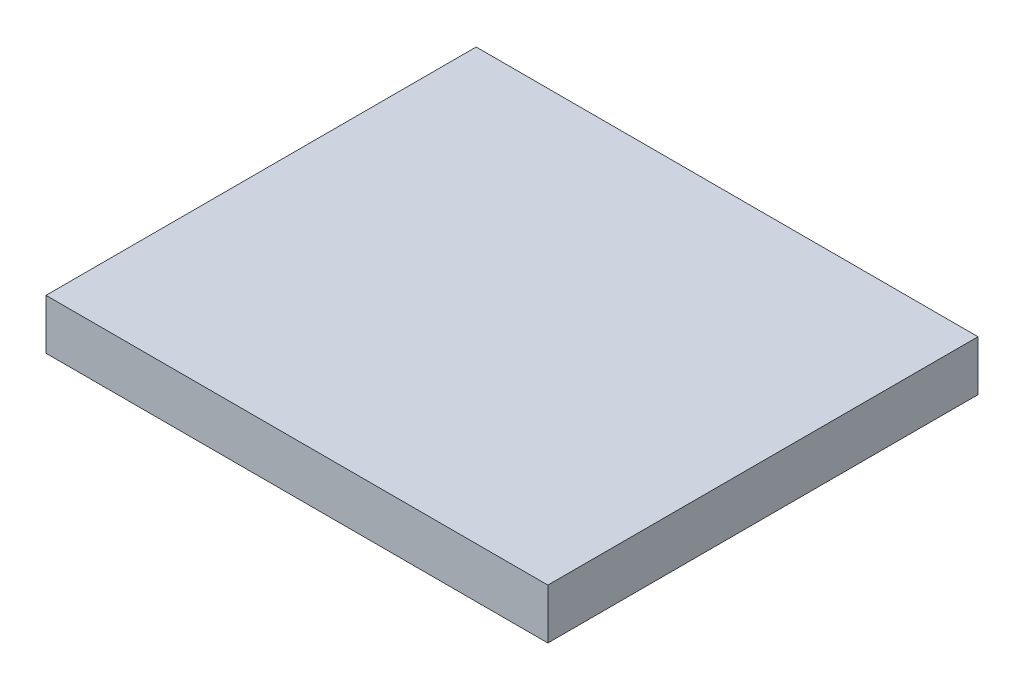
ISO-10303-21;
HEADER;
FILE_DESCRIPTION(('STEP AP214'),'2;1');
FILE_NAME('part.step','',(''),(''),'','','');
FILE_SCHEMA(('AUTOMOTIVE_DESIGN { 1 0 10303 214 1 1 1 1 }'));
ENDSEC;
DATA;
#1=APPLICATION_CONTEXT('core data for automotive mechanical design processes');
#2=APPLICATION_PROTOCOL_DEFINITION('international standard','automotive_design',2000,#1);
#3=PRODUCT_CONTEXT('',#1,'mechanical');
#4=PRODUCT('Part','Part','',(#3));
#5=PRODUCT_RELATED_PRODUCT_CATEGORY('part','',(#4));
#6=PRODUCT_DEFINITION_FORMATION('','',#4);
#7=PRODUCT_DEFINITION_CONTEXT('part definition',#1,'design');
#8=PRODUCT_DEFINITION('design','',#6,#7);
#9=PRODUCT_DEFINITION_SHAPE('','',#8);
#10=(LENGTH_UNIT() NAMED_UNIT(*) SI_UNIT(.MILLI.,.METRE.));
#11=(NAMED_UNIT(*) PLANE_ANGLE_UNIT() SI_UNIT($,.RADIAN.));
#12=(NAMED_UNIT(*) SI_UNIT($,.STERADIAN.) SOLID_ANGLE_UNIT());
#13=UNCERTAINTY_MEASURE_WITH_UNIT(LENGTH_MEASURE(1.E-05),#10,'distance_accuracy_value','');
#14=(GEOMETRIC_REPRESENTATION_CONTEXT(3) GLOBAL_UNCERTAINTY_ASSIGNED_CONTEXT((#13)) GLOBAL_UNIT_ASSIGNED_CONTEXT((#10,
#11,#12)) REPRESENTATION_CONTEXT('',''));
#15=CARTESIAN_POINT('',(0.,0.,0.));
#16=DIRECTION('',(0.,0.,1.));
#17=DIRECTION('',(1.,0.,0.));
#18=AXIS2_PLACEMENT_3D('',#15,#16,#17);
#19=CARTESIAN_POINT('',(17.5,3.5,15.));
#20=DIRECTION('',(-1.,0.,0.));
#21=DIRECTION('',(0.,0.,1.));
#22=AXIS2_PLACEMENT_3D('',#19,#20,#21);
#23=PLANE('',#22);
#24=DIRECTION('',(0.,0.,-1.));
#25=VECTOR('',#24,1.);
#26=CARTESIAN_POINT('',(17.5,0.,15.));
#27=LINE('',#26,#25);
#28=CARTESIAN_POINT('',(17.5,0.,15.));
#29=VERTEX_POINT('',#28);
#30=CARTESIAN_POINT('',(17.5,0.,-15.));
#31=VERTEX_POINT('',#30);
#32=EDGE_CURVE('E102',#29,#31,#27,.T.);
#33=ORIENTED_EDGE('',*,*,#32,.T.);
#34=DIRECTION('',(0.,-1.,0.));
#35=VECTOR('',#34,1.);
#36=CARTESIAN_POINT('',(17.5,3.5,-15.));
#37=LINE('',#36,#35);
#38=CARTESIAN_POINT('',(17.5,3.5,-15.));
#39=VERTEX_POINT('',#38);
#40=EDGE_CURVE('E11',#39,#31,#37,.T.);
#41=ORIENTED_EDGE('',*,*,#40,.F.);
#42=DIRECTION('',(0.,0.,-1.));
#43=VECTOR('',#42,1.);
#44=CARTESIAN_POINT('',(17.5,3.5,15.));
#45=LINE('',#44,#43);
#46=CARTESIAN_POINT('',(17.5,3.5,15.));
#47=VERTEX_POINT('',#46);
#48=EDGE_CURVE('E90',#47,#39,#45,.T.);
#49=ORIENTED_EDGE('',*,*,#48,.F.);
#50=DIRECTION('',(0.,-1.,0.));
#51=VECTOR('',#50,1.);
#52=CARTESIAN_POINT('',(17.5,3.5,15.));
#53=LINE('',#52,#51);
#54=EDGE_CURVE('E98',#47,#29,#53,.T.);
#55=ORIENTED_EDGE('',*,*,#54,.T.);
#56=EDGE_LOOP('',(#33,#41,#49,#55));
#57=FACE_BOUND('',#56,.T.);
#58=ADVANCED_FACE('F39',(#57),#23,.F.);
#59=CARTESIAN_POINT('',(-17.5,3.5,-15.));
#60=DIRECTION('',(0.,0.,1.));
#61=DIRECTION('',(1.,0.,0.));
#62=AXIS2_PLACEMENT_3D('',#59,#60,#61);
#63=PLANE('',#62);
#64=DIRECTION('',(-1.,0.,0.));
#65=VECTOR('',#64,1.);
#66=CARTESIAN_POINT('',(-17.5,0.,-15.));
#67=LINE('',#66,#65);
#68=CARTESIAN_POINT('',(-17.5,0.,-15.));
#69=VERTEX_POINT('',#68);
#70=EDGE_CURVE('E94',#31,#69,#67,.T.);
#71=ORIENTED_EDGE('',*,*,#70,.T.);
#72=DIRECTION('',(0.,-1.,0.));
#73=VECTOR('',#72,1.);
#74=CARTESIAN_POINT('',(-17.5,3.5,-15.));
#75=LINE('',#74,#73);
#76=CARTESIAN_POINT('',(-17.5,3.5,-15.));
#77=VERTEX_POINT('',#76);
#78=EDGE_CURVE('E47',#77,#69,#75,.T.);
#79=ORIENTED_EDGE('',*,*,#78,.F.);
#80=DIRECTION('',(-1.,0.,0.));
#81=VECTOR('',#80,1.);
#82=CARTESIAN_POINT('',(-17.5,3.5,-15.));
#83=LINE('',#82,#81);
#84=EDGE_CURVE('E85',#39,#77,#83,.T.);
#85=ORIENTED_EDGE('',*,*,#84,.F.);
#86=ORIENTED_EDGE('',*,*,#40,.T.);
#87=EDGE_LOOP('',(#71,#79,#85,#86));
#88=FACE_BOUND('',#87,.T.);
#89=ADVANCED_FACE('F93',(#88),#63,.F.);
#90=CARTESIAN_POINT('',(-17.5,3.5,15.));
#91=DIRECTION('',(1.,0.,0.));
#92=DIRECTION('',(0.,0.,-1.));
#93=AXIS2_PLACEMENT_3D('',#90,#91,#92);
#94=PLANE('',#93);
#95=DIRECTION('',(0.,0.,1.));
#96=VECTOR('',#95,1.);
#97=CARTESIAN_POINT('',(-17.5,0.,15.));
#98=LINE('',#97,#96);
#99=CARTESIAN_POINT('',(-17.5,0.,15.));
#100=VERTEX_POINT('',#99);
#101=EDGE_CURVE('E72',#69,#100,#98,.T.);
#102=ORIENTED_EDGE('',*,*,#101,.T.);
#103=DIRECTION('',(0.,-1.,0.));
#104=VECTOR('',#103,1.);
#105=CARTESIAN_POINT('',(-17.5,3.5,15.));
#106=LINE('',#105,#104);
#107=CARTESIAN_POINT('',(-17.5,3.5,15.));
#108=VERTEX_POINT('',#107);
#109=EDGE_CURVE('E95',#108,#100,#106,.T.);
#110=ORIENTED_EDGE('',*,*,#109,.F.);
#111=DIRECTION('',(0.,0.,1.));
#112=VECTOR('',#111,1.);
#113=CARTESIAN_POINT('',(-17.5,3.5,15.));
#114=LINE('',#113,#112);
#115=EDGE_CURVE('E88',#77,#108,#114,.T.);
#116=ORIENTED_EDGE('',*,*,#115,.F.);
#117=ORIENTED_EDGE('',*,*,#78,.T.);
#118=EDGE_LOOP('',(#102,#110,#116,#117));
#119=FACE_BOUND('',#118,.T.);
#120=ADVANCED_FACE('F96',(#119),#94,.F.);
#121=CARTESIAN_POINT('',(-17.5,3.5,15.));
#122=DIRECTION('',(0.,0.,-1.));
#123=DIRECTION('',(-1.,0.,0.));
#124=AXIS2_PLACEMENT_3D('',#121,#122,#123);
#125=PLANE('',#124);
#126=DIRECTION('',(1.,0.,0.));
#127=VECTOR('',#126,1.);
#128=CARTESIAN_POINT('',(-17.5,0.,15.));
#129=LINE('',#128,#127);
#130=EDGE_CURVE('E78',#100,#29,#129,.T.);
#131=ORIENTED_EDGE('',*,*,#130,.T.);
#132=ORIENTED_EDGE('',*,*,#54,.F.);
#133=DIRECTION('',(1.,0.,0.));
#134=VECTOR('',#133,1.);
#135=CARTESIAN_POINT('',(-17.5,3.5,15.));
#136=LINE('',#135,#134);
#137=EDGE_CURVE('E55',#108,#47,#136,.T.);
#138=ORIENTED_EDGE('',*,*,#137,.F.);
#139=ORIENTED_EDGE('',*,*,#109,.T.);
#140=EDGE_LOOP('',(#131,#132,#138,#139));
#141=FACE_BOUND('',#140,.T.);
#142=ADVANCED_FACE('F109',(#141),#125,.F.);
#143=CARTESIAN_POINT('',(0.,3.5,0.));
#144=DIRECTION('',(0.,-1.,0.));
#145=DIRECTION('',(0.,0.,-1.));
#146=AXIS2_PLACEMENT_3D('',#143,#144,#145);
#147=PLANE('',#146);
#148=ORIENTED_EDGE('',*,*,#48,.T.);
#149=ORIENTED_EDGE('',*,*,#84,.T.);
#150=ORIENTED_EDGE('',*,*,#115,.T.);
#151=ORIENTED_EDGE('',*,*,#137,.T.);
#152=EDGE_LOOP('',(#148,#149,#150,#151));
#153=FACE_BOUND('',#152,.T.);
#154=ADVANCED_FACE('F86',(#153),#147,.F.);
#155=CARTESIAN_POINT('',(0.,0.,0.));
#156=DIRECTION('',(0.,-1.,0.));
#157=DIRECTION('',(0.,0.,-1.));
#158=AXIS2_PLACEMENT_3D('',#155,#156,#157);
#159=PLANE('',#158);
#160=ORIENTED_EDGE('',*,*,#32,.F.);
#161=ORIENTED_EDGE('',*,*,#130,.F.);
#162=ORIENTED_EDGE('',*,*,#101,.F.);
#163=ORIENTED_EDGE('',*,*,#70,.F.);
#164=EDGE_LOOP('',(#160,#161,#162,#163));
#165=FACE_BOUND('',#164,.T.);
#166=ADVANCED_FACE('F112',(#165),#159,.T.);
#167=CLOSED_SHELL('',(#58,#89,#120,#142,#154,#166));
#168=MANIFOLD_SOLID_BREP('B2',#167);
#169=ADVANCED_BREP_SHAPE_REPRESENTATION('',(#18,#168),#14);
#170=SHAPE_DEFINITION_REPRESENTATION(#9,#169);
ENDSEC;
END-ISO-10303-21;
